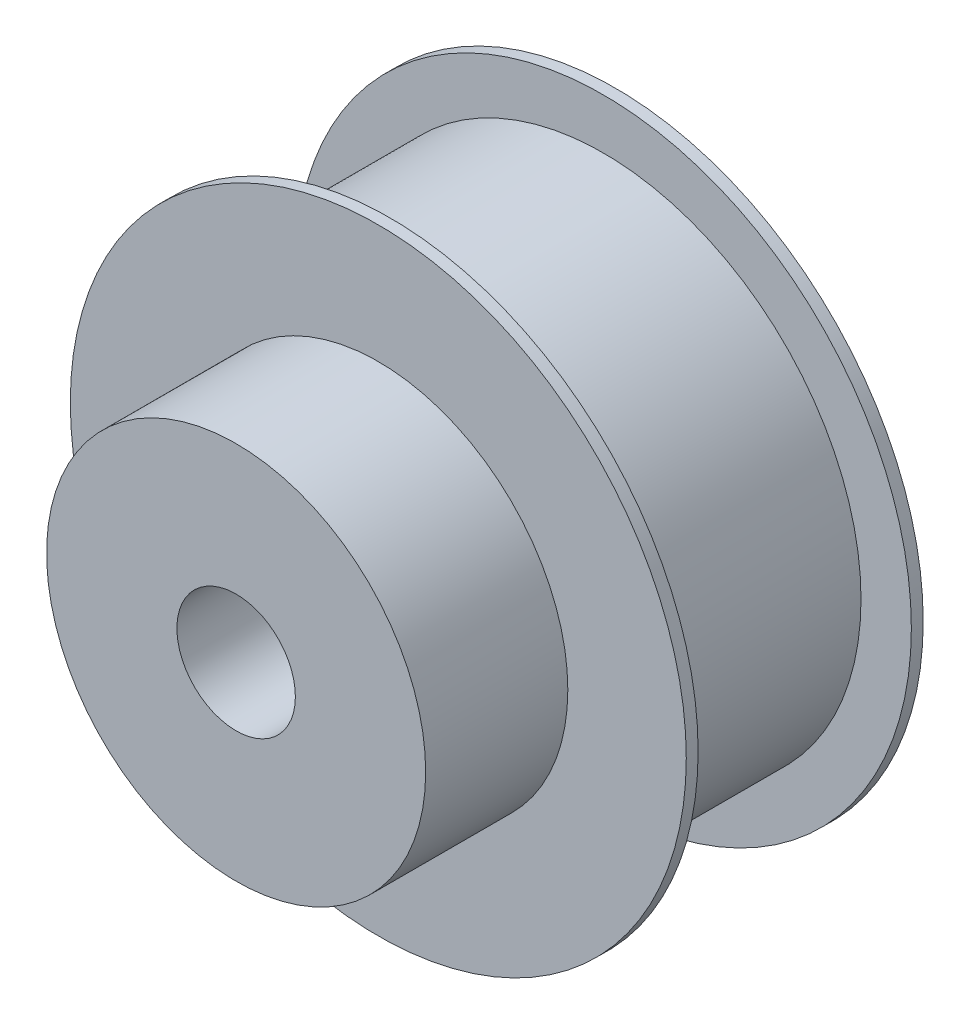
ISO-10303-21;
HEADER;
FILE_DESCRIPTION(('STEP AP214'),'2;1');
FILE_NAME('part.step','',(''),(''),'','','');
FILE_SCHEMA(('AUTOMOTIVE_DESIGN { 1 0 10303 214 1 1 1 1 }'));
ENDSEC;
DATA;
#1=APPLICATION_CONTEXT('core data for automotive mechanical design processes');
#2=APPLICATION_PROTOCOL_DEFINITION('international standard','automotive_design',2000,#1);
#3=PRODUCT_CONTEXT('',#1,'mechanical');
#4=PRODUCT('Part','Part','',(#3));
#5=PRODUCT_RELATED_PRODUCT_CATEGORY('part','',(#4));
#6=PRODUCT_DEFINITION_FORMATION('','',#4);
#7=PRODUCT_DEFINITION_CONTEXT('part definition',#1,'design');
#8=PRODUCT_DEFINITION('design','',#6,#7);
#9=PRODUCT_DEFINITION_SHAPE('','',#8);
#10=(LENGTH_UNIT() NAMED_UNIT(*) SI_UNIT(.MILLI.,.METRE.));
#11=(NAMED_UNIT(*) PLANE_ANGLE_UNIT() SI_UNIT($,.RADIAN.));
#12=(NAMED_UNIT(*) SI_UNIT($,.STERADIAN.) SOLID_ANGLE_UNIT());
#13=UNCERTAINTY_MEASURE_WITH_UNIT(LENGTH_MEASURE(1.E-05),#10,'distance_accuracy_value','');
#14=(GEOMETRIC_REPRESENTATION_CONTEXT(3) GLOBAL_UNCERTAINTY_ASSIGNED_CONTEXT((#13)) GLOBAL_UNIT_ASSIGNED_CONTEXT((#10,
#11,#12)) REPRESENTATION_CONTEXT('',''));
#15=CARTESIAN_POINT('',(0.,0.,0.));
#16=DIRECTION('',(0.,0.,1.));
#17=DIRECTION('',(1.,0.,0.));
#18=AXIS2_PLACEMENT_3D('',#15,#16,#17);
#19=CARTESIAN_POINT('',(0.,0.,10.));
#20=DIRECTION('',(0.,0.,1.));
#21=DIRECTION('',(1.,0.,0.));
#22=AXIS2_PLACEMENT_3D('',#19,#20,#21);
#23=PLANE('',#22);
#24=CARTESIAN_POINT('',(0.,0.,10.));
#25=DIRECTION('',(0.,0.,1.));
#26=DIRECTION('',(1.,0.,0.));
#27=AXIS2_PLACEMENT_3D('',#24,#25,#26);
#28=CIRCLE('',#27,13.);
#29=CARTESIAN_POINT('',(13.,0.,10.));
#30=VERTEX_POINT('',#29);
#31=EDGE_CURVE('E44',#30,#30,#28,.T.);
#32=ORIENTED_EDGE('',*,*,#31,.T.);
#33=EDGE_LOOP('',(#32));
#34=FACE_BOUND('',#33,.T.);
#35=CARTESIAN_POINT('',(0.,0.,10.));
#36=DIRECTION('',(0.,0.,1.));
#37=DIRECTION('',(1.,0.,0.));
#38=AXIS2_PLACEMENT_3D('',#35,#36,#37);
#39=CIRCLE('',#38,8.);
#40=CARTESIAN_POINT('',(8.,0.,10.));
#41=VERTEX_POINT('',#40);
#42=EDGE_CURVE('E53',#41,#41,#39,.T.);
#43=ORIENTED_EDGE('',*,*,#42,.F.);
#44=EDGE_LOOP('',(#43));
#45=FACE_BOUND('',#44,.T.);
#46=ADVANCED_FACE('F28',(#34,#45),#23,.T.);
#47=CARTESIAN_POINT('',(0.,0.,0.5));
#48=DIRECTION('',(0.,0.,1.));
#49=DIRECTION('',(1.,0.,0.));
#50=AXIS2_PLACEMENT_3D('',#47,#48,#49);
#51=PLANE('',#50);
#52=CARTESIAN_POINT('',(0.,0.,0.5));
#53=DIRECTION('',(0.,0.,1.));
#54=DIRECTION('',(1.,0.,0.));
#55=AXIS2_PLACEMENT_3D('',#52,#53,#54);
#56=CIRCLE('',#55,13.);
#57=CARTESIAN_POINT('',(13.,0.,0.5));
#58=VERTEX_POINT('',#57);
#59=EDGE_CURVE('E10',#58,#58,#56,.T.);
#60=ORIENTED_EDGE('',*,*,#59,.T.);
#61=EDGE_LOOP('',(#60));
#62=FACE_BOUND('',#61,.T.);
#63=CARTESIAN_POINT('',(0.,0.,0.5));
#64=DIRECTION('',(0.,0.,1.));
#65=DIRECTION('',(1.,0.,0.));
#66=AXIS2_PLACEMENT_3D('',#63,#64,#65);
#67=CIRCLE('',#66,10.875);
#68=CARTESIAN_POINT('',(10.875,0.,0.5));
#69=VERTEX_POINT('',#68);
#70=EDGE_CURVE('E41',#69,#69,#67,.T.);
#71=ORIENTED_EDGE('',*,*,#70,.F.);
#72=EDGE_LOOP('',(#71));
#73=FACE_BOUND('',#72,.T.);
#74=ADVANCED_FACE('F88',(#62,#73),#51,.T.);
#75=CARTESIAN_POINT('',(0.,0.,0.5));
#76=DIRECTION('',(0.,0.,-1.));
#77=DIRECTION('',(-1.,0.,0.));
#78=AXIS2_PLACEMENT_3D('',#75,#76,#77);
#79=CYLINDRICAL_SURFACE('',#78,13.);
#80=ORIENTED_EDGE('',*,*,#59,.F.);
#81=EDGE_LOOP('',(#80));
#82=FACE_BOUND('',#81,.T.);
#83=CARTESIAN_POINT('',(0.,0.,0.));
#84=DIRECTION('',(0.,0.,1.));
#85=DIRECTION('',(1.,0.,0.));
#86=AXIS2_PLACEMENT_3D('',#83,#84,#85);
#87=CIRCLE('',#86,13.);
#88=CARTESIAN_POINT('',(13.,0.,0.));
#89=VERTEX_POINT('',#88);
#90=EDGE_CURVE('E32',#89,#89,#87,.T.);
#91=ORIENTED_EDGE('',*,*,#90,.T.);
#92=EDGE_LOOP('',(#91));
#93=FACE_BOUND('',#92,.T.);
#94=ADVANCED_FACE('F30',(#82,#93),#79,.T.);
#95=CARTESIAN_POINT('',(0.,0.,0.));
#96=DIRECTION('',(0.,0.,1.));
#97=DIRECTION('',(1.,0.,0.));
#98=AXIS2_PLACEMENT_3D('',#95,#96,#97);
#99=PLANE('',#98);
#100=CARTESIAN_POINT('',(0.,0.,0.));
#101=DIRECTION('',(0.,0.,1.));
#102=DIRECTION('',(1.,0.,0.));
#103=AXIS2_PLACEMENT_3D('',#100,#101,#102);
#104=CIRCLE('',#103,2.5);
#105=CARTESIAN_POINT('',(2.5,0.,0.));
#106=VERTEX_POINT('',#105);
#107=EDGE_CURVE('E56',#106,#106,#104,.T.);
#108=ORIENTED_EDGE('',*,*,#107,.T.);
#109=EDGE_LOOP('',(#108));
#110=FACE_BOUND('',#109,.T.);
#111=ORIENTED_EDGE('',*,*,#90,.F.);
#112=EDGE_LOOP('',(#111));
#113=FACE_BOUND('',#112,.T.);
#114=ADVANCED_FACE('F65',(#110,#113),#99,.F.);
#115=CARTESIAN_POINT('',(0.,0.,9.5));
#116=DIRECTION('',(0.,0.,-1.));
#117=DIRECTION('',(-1.,0.,0.));
#118=AXIS2_PLACEMENT_3D('',#115,#116,#117);
#119=CYLINDRICAL_SURFACE('',#118,10.875);
#120=CARTESIAN_POINT('',(0.,0.,9.5));
#121=DIRECTION('',(0.,0.,1.));
#122=DIRECTION('',(1.,0.,0.));
#123=AXIS2_PLACEMENT_3D('',#120,#121,#122);
#124=CIRCLE('',#123,10.875);
#125=CARTESIAN_POINT('',(10.875,0.,9.5));
#126=VERTEX_POINT('',#125);
#127=EDGE_CURVE('E39',#126,#126,#124,.T.);
#128=ORIENTED_EDGE('',*,*,#127,.F.);
#129=EDGE_LOOP('',(#128));
#130=FACE_BOUND('',#129,.T.);
#131=ORIENTED_EDGE('',*,*,#70,.T.);
#132=EDGE_LOOP('',(#131));
#133=FACE_BOUND('',#132,.T.);
#134=ADVANCED_FACE('F99',(#130,#133),#119,.T.);
#135=CARTESIAN_POINT('',(0.,0.,9.5));
#136=DIRECTION('',(0.,0.,1.));
#137=DIRECTION('',(1.,0.,0.));
#138=AXIS2_PLACEMENT_3D('',#135,#136,#137);
#139=PLANE('',#138);
#140=CARTESIAN_POINT('',(0.,0.,9.5));
#141=DIRECTION('',(0.,0.,1.));
#142=DIRECTION('',(1.,0.,0.));
#143=AXIS2_PLACEMENT_3D('',#140,#141,#142);
#144=CIRCLE('',#143,13.);
#145=CARTESIAN_POINT('',(13.,0.,9.5));
#146=VERTEX_POINT('',#145);
#147=EDGE_CURVE('E47',#146,#146,#144,.T.);
#148=ORIENTED_EDGE('',*,*,#147,.F.);
#149=EDGE_LOOP('',(#148));
#150=FACE_BOUND('',#149,.T.);
#151=ORIENTED_EDGE('',*,*,#127,.T.);
#152=EDGE_LOOP('',(#151));
#153=FACE_BOUND('',#152,.T.);
#154=ADVANCED_FACE('F96',(#150,#153),#139,.F.);
#155=CARTESIAN_POINT('',(0.,0.,10.));
#156=DIRECTION('',(0.,0.,-1.));
#157=DIRECTION('',(-1.,0.,0.));
#158=AXIS2_PLACEMENT_3D('',#155,#156,#157);
#159=CYLINDRICAL_SURFACE('',#158,13.);
#160=ORIENTED_EDGE('',*,*,#31,.F.);
#161=EDGE_LOOP('',(#160));
#162=FACE_BOUND('',#161,.T.);
#163=ORIENTED_EDGE('',*,*,#147,.T.);
#164=EDGE_LOOP('',(#163));
#165=FACE_BOUND('',#164,.T.);
#166=ADVANCED_FACE('F83',(#162,#165),#159,.T.);
#167=CARTESIAN_POINT('',(0.,0.,16.));
#168=DIRECTION('',(0.,0.,-1.));
#169=DIRECTION('',(-1.,0.,0.));
#170=AXIS2_PLACEMENT_3D('',#167,#168,#169);
#171=CYLINDRICAL_SURFACE('',#170,8.);
#172=CARTESIAN_POINT('',(0.,0.,16.));
#173=DIRECTION('',(0.,0.,1.));
#174=DIRECTION('',(1.,0.,0.));
#175=AXIS2_PLACEMENT_3D('',#172,#173,#174);
#176=CIRCLE('',#175,8.);
#177=CARTESIAN_POINT('',(8.,0.,16.));
#178=VERTEX_POINT('',#177);
#179=EDGE_CURVE('E50',#178,#178,#176,.T.);
#180=ORIENTED_EDGE('',*,*,#179,.F.);
#181=EDGE_LOOP('',(#180));
#182=FACE_BOUND('',#181,.T.);
#183=ORIENTED_EDGE('',*,*,#42,.T.);
#184=EDGE_LOOP('',(#183));
#185=FACE_BOUND('',#184,.T.);
#186=ADVANCED_FACE('F77',(#182,#185),#171,.T.);
#187=CARTESIAN_POINT('',(0.,0.,16.));
#188=DIRECTION('',(0.,0.,1.));
#189=DIRECTION('',(1.,0.,0.));
#190=AXIS2_PLACEMENT_3D('',#187,#188,#189);
#191=PLANE('',#190);
#192=CARTESIAN_POINT('',(0.,0.,16.));
#193=DIRECTION('',(0.,0.,1.));
#194=DIRECTION('',(1.,0.,0.));
#195=AXIS2_PLACEMENT_3D('',#192,#193,#194);
#196=CIRCLE('',#195,2.5);
#197=CARTESIAN_POINT('',(2.5,0.,16.));
#198=VERTEX_POINT('',#197);
#199=EDGE_CURVE('E59',#198,#198,#196,.T.);
#200=ORIENTED_EDGE('',*,*,#199,.F.);
#201=EDGE_LOOP('',(#200));
#202=FACE_BOUND('',#201,.T.);
#203=ORIENTED_EDGE('',*,*,#179,.T.);
#204=EDGE_LOOP('',(#203));
#205=FACE_BOUND('',#204,.T.);
#206=ADVANCED_FACE('F71',(#202,#205),#191,.T.);
#207=CARTESIAN_POINT('',(0.,0.,0.));
#208=DIRECTION('',(0.,0.,1.));
#209=DIRECTION('',(1.,0.,0.));
#210=AXIS2_PLACEMENT_3D('',#207,#208,#209);
#211=CYLINDRICAL_SURFACE('',#210,2.5);
#212=ORIENTED_EDGE('',*,*,#107,.F.);
#213=EDGE_LOOP('',(#212));
#214=FACE_BOUND('',#213,.T.);
#215=ORIENTED_EDGE('',*,*,#199,.T.);
#216=EDGE_LOOP('',(#215));
#217=FACE_BOUND('',#216,.T.);
#218=ADVANCED_FACE('F68',(#214,#217),#211,.F.);
#219=CLOSED_SHELL('',(#46,#74,#94,#114,#134,#154,#166,#186,#206,#218));
#220=MANIFOLD_SOLID_BREP('B2',#219);
#221=ADVANCED_BREP_SHAPE_REPRESENTATION('',(#18,#220),#14);
#222=SHAPE_DEFINITION_REPRESENTATION(#9,#221);
ENDSEC;
END-ISO-10303-21;
